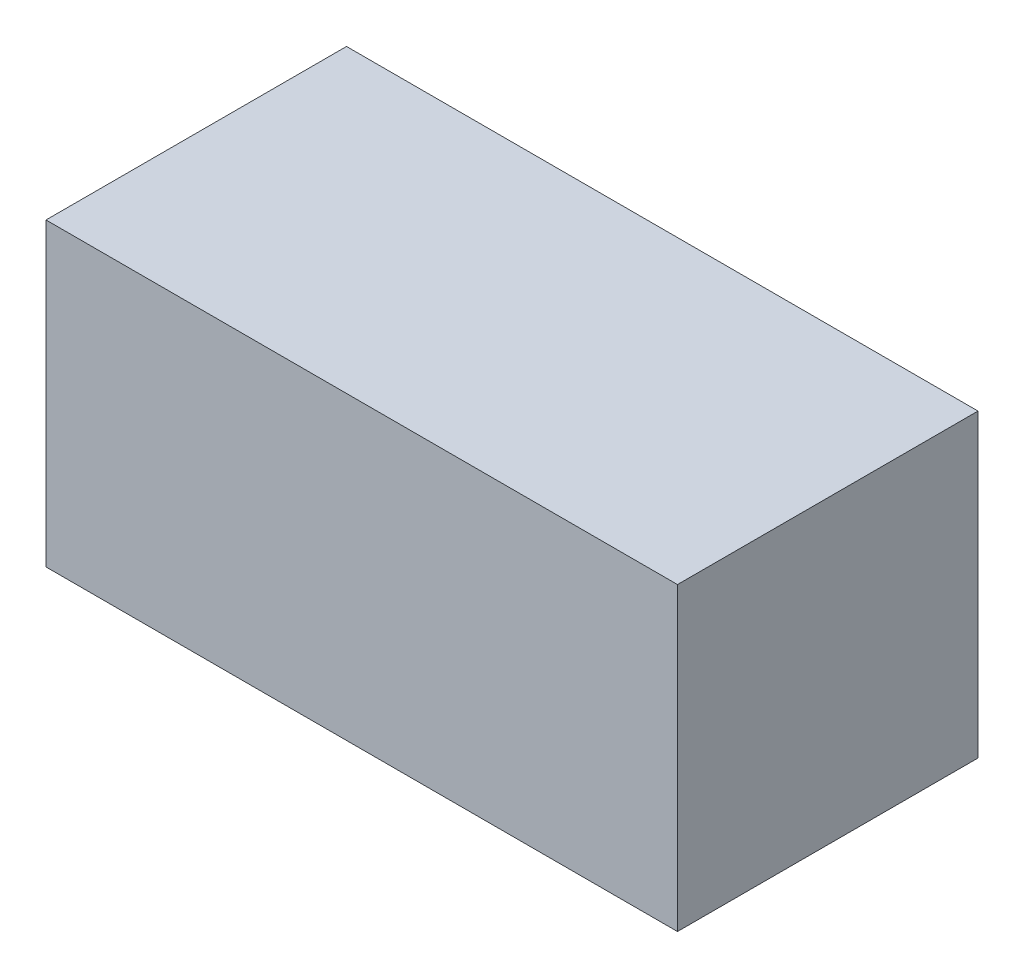
ISO-10303-21;
HEADER;
FILE_DESCRIPTION(('STEP AP214'),'2;1');
FILE_NAME('part.step','',(''),(''),'','','');
FILE_SCHEMA(('AUTOMOTIVE_DESIGN { 1 0 10303 214 1 1 1 1 }'));
ENDSEC;
DATA;
#1=APPLICATION_CONTEXT('core data for automotive mechanical design processes');
#2=APPLICATION_PROTOCOL_DEFINITION('international standard','automotive_design',2000,#1);
#3=PRODUCT_CONTEXT('',#1,'mechanical');
#4=PRODUCT('Part','Part','',(#3));
#5=PRODUCT_RELATED_PRODUCT_CATEGORY('part','',(#4));
#6=PRODUCT_DEFINITION_FORMATION('','',#4);
#7=PRODUCT_DEFINITION_CONTEXT('part definition',#1,'design');
#8=PRODUCT_DEFINITION('design','',#6,#7);
#9=PRODUCT_DEFINITION_SHAPE('','',#8);
#10=(LENGTH_UNIT() NAMED_UNIT(*) SI_UNIT(.MILLI.,.METRE.));
#11=(NAMED_UNIT(*) PLANE_ANGLE_UNIT() SI_UNIT($,.RADIAN.));
#12=(NAMED_UNIT(*) SI_UNIT($,.STERADIAN.) SOLID_ANGLE_UNIT());
#13=UNCERTAINTY_MEASURE_WITH_UNIT(LENGTH_MEASURE(1.E-05),#10,'distance_accuracy_value','');
#14=(GEOMETRIC_REPRESENTATION_CONTEXT(3) GLOBAL_UNCERTAINTY_ASSIGNED_CONTEXT((#13)) GLOBAL_UNIT_ASSIGNED_CONTEXT((#10,
#11,#12)) REPRESENTATION_CONTEXT('',''));
#15=CARTESIAN_POINT('',(0.,0.,0.));
#16=DIRECTION('',(0.,0.,1.));
#17=DIRECTION('',(1.,0.,0.));
#18=AXIS2_PLACEMENT_3D('',#15,#16,#17);
#19=CARTESIAN_POINT('',(-5.0038,-2.38125,-2.38125));
#20=DIRECTION('',(-1.,0.,0.));
#21=DIRECTION('',(0.,0.,1.));
#22=AXIS2_PLACEMENT_3D('',#19,#20,#21);
#23=PLANE('',#22);
#24=DIRECTION('',(0.,1.,0.));
#25=VECTOR('',#24,1.);
#26=CARTESIAN_POINT('',(-5.0038,-2.38125,2.38125));
#27=LINE('',#26,#25);
#28=CARTESIAN_POINT('',(-5.0038,-2.38125,2.38125));
#29=VERTEX_POINT('',#28);
#30=CARTESIAN_POINT('',(-5.0038,2.38125,2.38125));
#31=VERTEX_POINT('',#30);
#32=EDGE_CURVE('E44',#29,#31,#27,.T.);
#33=ORIENTED_EDGE('',*,*,#32,.T.);
#34=DIRECTION('',(0.,0.,1.));
#35=VECTOR('',#34,1.);
#36=CARTESIAN_POINT('',(-5.0038,2.38125,-2.38125));
#37=LINE('',#36,#35);
#38=CARTESIAN_POINT('',(-5.0038,2.38125,-2.38125));
#39=VERTEX_POINT('',#38);
#40=EDGE_CURVE('E81',#39,#31,#37,.T.);
#41=ORIENTED_EDGE('',*,*,#40,.F.);
#42=DIRECTION('',(0.,1.,0.));
#43=VECTOR('',#42,1.);
#44=CARTESIAN_POINT('',(-5.0038,-2.38125,-2.38125));
#45=LINE('',#44,#43);
#46=CARTESIAN_POINT('',(-5.0038,-2.38125,-2.38125));
#47=VERTEX_POINT('',#46);
#48=EDGE_CURVE('E11',#47,#39,#45,.T.);
#49=ORIENTED_EDGE('',*,*,#48,.F.);
#50=DIRECTION('',(0.,0.,1.));
#51=VECTOR('',#50,1.);
#52=CARTESIAN_POINT('',(-5.0038,-2.38125,-2.38125));
#53=LINE('',#52,#51);
#54=EDGE_CURVE('E82',#47,#29,#53,.T.);
#55=ORIENTED_EDGE('',*,*,#54,.T.);
#56=EDGE_LOOP('',(#33,#41,#49,#55));
#57=FACE_BOUND('',#56,.T.);
#58=ADVANCED_FACE('F41',(#57),#23,.T.);
#59=CARTESIAN_POINT('',(-5.0038,-2.38125,-2.38125));
#60=DIRECTION('',(0.,0.,-1.));
#61=DIRECTION('',(-1.,0.,0.));
#62=AXIS2_PLACEMENT_3D('',#59,#60,#61);
#63=PLANE('',#62);
#64=ORIENTED_EDGE('',*,*,#48,.T.);
#65=DIRECTION('',(-1.,0.,0.));
#66=VECTOR('',#65,1.);
#67=CARTESIAN_POINT('',(-5.0038,2.38125,-2.38125));
#68=LINE('',#67,#66);
#69=CARTESIAN_POINT('',(5.0038,2.38125,-2.38125));
#70=VERTEX_POINT('',#69);
#71=EDGE_CURVE('E98',#70,#39,#68,.T.);
#72=ORIENTED_EDGE('',*,*,#71,.F.);
#73=DIRECTION('',(0.,1.,0.));
#74=VECTOR('',#73,1.);
#75=CARTESIAN_POINT('',(5.0038,-2.38125,-2.38125));
#76=LINE('',#75,#74);
#77=CARTESIAN_POINT('',(5.0038,-2.38125,-2.38125));
#78=VERTEX_POINT('',#77);
#79=EDGE_CURVE('E49',#78,#70,#76,.T.);
#80=ORIENTED_EDGE('',*,*,#79,.F.);
#81=DIRECTION('',(-1.,0.,0.));
#82=VECTOR('',#81,1.);
#83=CARTESIAN_POINT('',(-5.0038,-2.38125,-2.38125));
#84=LINE('',#83,#82);
#85=EDGE_CURVE('E87',#78,#47,#84,.T.);
#86=ORIENTED_EDGE('',*,*,#85,.T.);
#87=EDGE_LOOP('',(#64,#72,#80,#86));
#88=FACE_BOUND('',#87,.T.);
#89=ADVANCED_FACE('F113',(#88),#63,.T.);
#90=CARTESIAN_POINT('',(5.0038,-2.38125,-2.38125));
#91=DIRECTION('',(1.,0.,0.));
#92=DIRECTION('',(0.,0.,-1.));
#93=AXIS2_PLACEMENT_3D('',#90,#91,#92);
#94=PLANE('',#93);
#95=ORIENTED_EDGE('',*,*,#79,.T.);
#96=DIRECTION('',(0.,0.,-1.));
#97=VECTOR('',#96,1.);
#98=CARTESIAN_POINT('',(5.0038,2.38125,-2.38125));
#99=LINE('',#98,#97);
#100=CARTESIAN_POINT('',(5.0038,2.38125,2.38125));
#101=VERTEX_POINT('',#100);
#102=EDGE_CURVE('E94',#101,#70,#99,.T.);
#103=ORIENTED_EDGE('',*,*,#102,.F.);
#104=DIRECTION('',(0.,1.,0.));
#105=VECTOR('',#104,1.);
#106=CARTESIAN_POINT('',(5.0038,-2.38125,2.38125));
#107=LINE('',#106,#105);
#108=CARTESIAN_POINT('',(5.0038,-2.38125,2.38125));
#109=VERTEX_POINT('',#108);
#110=EDGE_CURVE('E86',#109,#101,#107,.T.);
#111=ORIENTED_EDGE('',*,*,#110,.F.);
#112=DIRECTION('',(0.,0.,-1.));
#113=VECTOR('',#112,1.);
#114=CARTESIAN_POINT('',(5.0038,-2.38125,-2.38125));
#115=LINE('',#114,#113);
#116=EDGE_CURVE('E106',#109,#78,#115,.T.);
#117=ORIENTED_EDGE('',*,*,#116,.T.);
#118=EDGE_LOOP('',(#95,#103,#111,#117));
#119=FACE_BOUND('',#118,.T.);
#120=ADVANCED_FACE('F110',(#119),#94,.T.);
#121=CARTESIAN_POINT('',(-5.0038,-2.38125,2.38125));
#122=DIRECTION('',(0.,0.,1.));
#123=DIRECTION('',(1.,0.,0.));
#124=AXIS2_PLACEMENT_3D('',#121,#122,#123);
#125=PLANE('',#124);
#126=ORIENTED_EDGE('',*,*,#110,.T.);
#127=DIRECTION('',(1.,0.,0.));
#128=VECTOR('',#127,1.);
#129=CARTESIAN_POINT('',(-5.0038,2.38125,2.38125));
#130=LINE('',#129,#128);
#131=EDGE_CURVE('E89',#31,#101,#130,.T.);
#132=ORIENTED_EDGE('',*,*,#131,.F.);
#133=ORIENTED_EDGE('',*,*,#32,.F.);
#134=DIRECTION('',(1.,0.,0.));
#135=VECTOR('',#134,1.);
#136=CARTESIAN_POINT('',(-5.0038,-2.38125,2.38125));
#137=LINE('',#136,#135);
#138=EDGE_CURVE('E104',#29,#109,#137,.T.);
#139=ORIENTED_EDGE('',*,*,#138,.T.);
#140=EDGE_LOOP('',(#126,#132,#133,#139));
#141=FACE_BOUND('',#140,.T.);
#142=ADVANCED_FACE('F90',(#141),#125,.T.);
#143=CARTESIAN_POINT('',(-5.0038,-2.38125,2.38125));
#144=DIRECTION('',(0.,1.,0.));
#145=DIRECTION('',(0.,0.,1.));
#146=AXIS2_PLACEMENT_3D('',#143,#144,#145);
#147=PLANE('',#146);
#148=ORIENTED_EDGE('',*,*,#54,.F.);
#149=ORIENTED_EDGE('',*,*,#85,.F.);
#150=ORIENTED_EDGE('',*,*,#116,.F.);
#151=ORIENTED_EDGE('',*,*,#138,.F.);
#152=EDGE_LOOP('',(#148,#149,#150,#151));
#153=FACE_BOUND('',#152,.T.);
#154=ADVANCED_FACE('F115',(#153),#147,.F.);
#155=CARTESIAN_POINT('',(-5.0038,2.38125,2.38125));
#156=DIRECTION('',(0.,1.,0.));
#157=DIRECTION('',(0.,0.,1.));
#158=AXIS2_PLACEMENT_3D('',#155,#156,#157);
#159=PLANE('',#158);
#160=ORIENTED_EDGE('',*,*,#40,.T.);
#161=ORIENTED_EDGE('',*,*,#131,.T.);
#162=ORIENTED_EDGE('',*,*,#102,.T.);
#163=ORIENTED_EDGE('',*,*,#71,.T.);
#164=EDGE_LOOP('',(#160,#161,#162,#163));
#165=FACE_BOUND('',#164,.T.);
#166=ADVANCED_FACE('F97',(#165),#159,.T.);
#167=CLOSED_SHELL('',(#58,#89,#120,#142,#154,#166));
#168=MANIFOLD_SOLID_BREP('B2',#167);
#169=ADVANCED_BREP_SHAPE_REPRESENTATION('',(#18,#168),#14);
#170=SHAPE_DEFINITION_REPRESENTATION(#9,#169);
ENDSEC;
END-ISO-10303-21;
